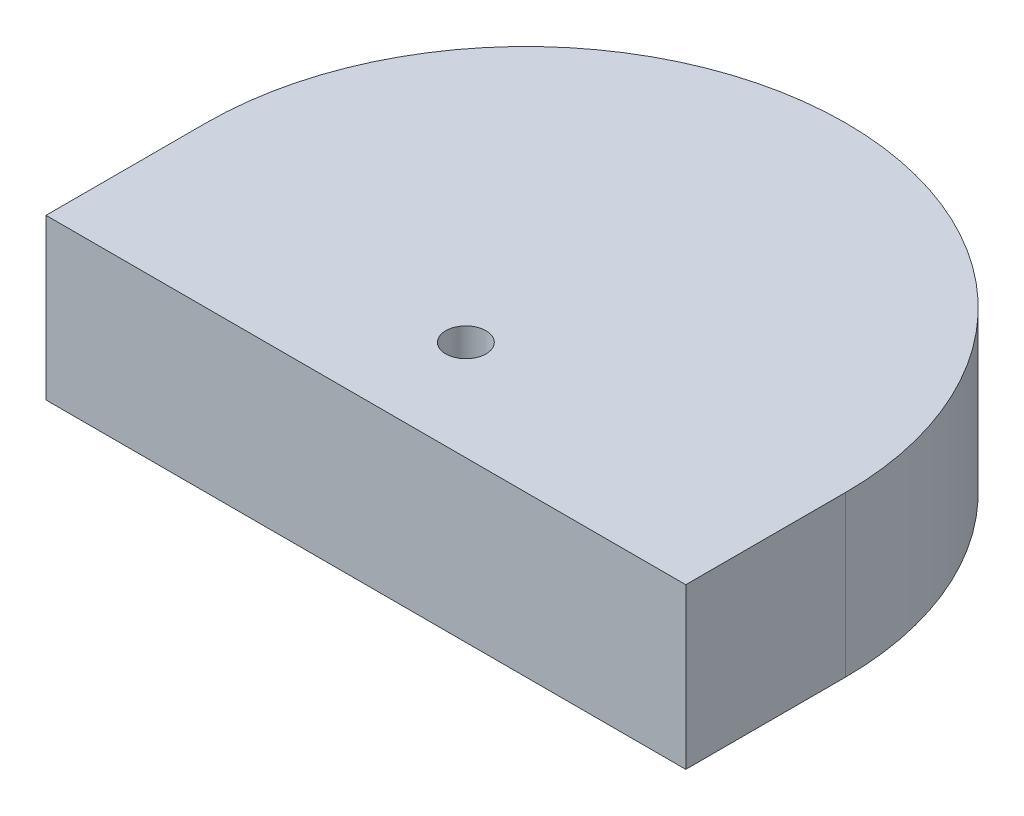
ISO-10303-21;
HEADER;
FILE_DESCRIPTION(('STEP AP214'),'2;1');
FILE_NAME('part.step','',(''),(''),'','','');
FILE_SCHEMA(('AUTOMOTIVE_DESIGN { 1 0 10303 214 1 1 1 1 }'));
ENDSEC;
DATA;
#1=APPLICATION_CONTEXT('core data for automotive mechanical design processes');
#2=APPLICATION_PROTOCOL_DEFINITION('international standard','automotive_design',2000,#1);
#3=PRODUCT_CONTEXT('',#1,'mechanical');
#4=PRODUCT('Part','Part','',(#3));
#5=PRODUCT_RELATED_PRODUCT_CATEGORY('part','',(#4));
#6=PRODUCT_DEFINITION_FORMATION('','',#4);
#7=PRODUCT_DEFINITION_CONTEXT('part definition',#1,'design');
#8=PRODUCT_DEFINITION('design','',#6,#7);
#9=PRODUCT_DEFINITION_SHAPE('','',#8);
#10=(LENGTH_UNIT() NAMED_UNIT(*) SI_UNIT(.MILLI.,.METRE.));
#11=(NAMED_UNIT(*) PLANE_ANGLE_UNIT() SI_UNIT($,.RADIAN.));
#12=(NAMED_UNIT(*) SI_UNIT($,.STERADIAN.) SOLID_ANGLE_UNIT());
#13=UNCERTAINTY_MEASURE_WITH_UNIT(LENGTH_MEASURE(1.E-05),#10,'distance_accuracy_value','');
#14=(GEOMETRIC_REPRESENTATION_CONTEXT(3) GLOBAL_UNCERTAINTY_ASSIGNED_CONTEXT((#13)) GLOBAL_UNIT_ASSIGNED_CONTEXT((#10,
#11,#12)) REPRESENTATION_CONTEXT('',''));
#15=CARTESIAN_POINT('',(0.,0.,0.));
#16=DIRECTION('',(0.,0.,1.));
#17=DIRECTION('',(1.,0.,0.));
#18=AXIS2_PLACEMENT_3D('',#15,#16,#17);
#19=CARTESIAN_POINT('',(0.,20.,0.));
#20=DIRECTION('',(0.,-1.,0.));
#21=DIRECTION('',(0.,0.,-1.));
#22=AXIS2_PLACEMENT_3D('',#19,#20,#21);
#23=CYLINDRICAL_SURFACE('',#22,40.);
#24=CARTESIAN_POINT('',(0.,0.,0.));
#25=DIRECTION('',(0.,1.,0.));
#26=DIRECTION('',(0.,0.,1.));
#27=AXIS2_PLACEMENT_3D('',#24,#25,#26);
#28=CIRCLE('',#27,40.);
#29=CARTESIAN_POINT('',(40.,0.,0.));
#30=VERTEX_POINT('',#29);
#31=CARTESIAN_POINT('',(-40.,0.,0.));
#32=VERTEX_POINT('',#31);
#33=EDGE_CURVE('E105',#30,#32,#28,.T.);
#34=ORIENTED_EDGE('',*,*,#33,.T.);
#35=DIRECTION('',(0.,-1.,0.));
#36=VECTOR('',#35,1.);
#37=CARTESIAN_POINT('',(-40.,20.,0.));
#38=LINE('',#37,#36);
#39=CARTESIAN_POINT('',(-40.,20.,0.));
#40=VERTEX_POINT('',#39);
#41=EDGE_CURVE('E11',#40,#32,#38,.T.);
#42=ORIENTED_EDGE('',*,*,#41,.F.);
#43=CARTESIAN_POINT('',(0.,20.,0.));
#44=DIRECTION('',(0.,1.,0.));
#45=DIRECTION('',(0.,0.,1.));
#46=AXIS2_PLACEMENT_3D('',#43,#44,#45);
#47=CIRCLE('',#46,40.);
#48=CARTESIAN_POINT('',(40.,20.,0.));
#49=VERTEX_POINT('',#48);
#50=EDGE_CURVE('E50',#49,#40,#47,.T.);
#51=ORIENTED_EDGE('',*,*,#50,.F.);
#52=DIRECTION('',(0.,-1.,0.));
#53=VECTOR('',#52,1.);
#54=CARTESIAN_POINT('',(40.,20.,0.));
#55=LINE('',#54,#53);
#56=EDGE_CURVE('E43',#49,#30,#55,.T.);
#57=ORIENTED_EDGE('',*,*,#56,.T.);
#58=EDGE_LOOP('',(#34,#42,#51,#57));
#59=FACE_BOUND('',#58,.T.);
#60=ADVANCED_FACE('F35',(#59),#23,.T.);
#61=CARTESIAN_POINT('',(0.,20.,0.));
#62=DIRECTION('',(0.,1.,0.));
#63=DIRECTION('',(0.,0.,1.));
#64=AXIS2_PLACEMENT_3D('',#61,#62,#63);
#65=PLANE('',#64);
#66=CARTESIAN_POINT('',(0.,20.,7.49999999999999));
#67=DIRECTION('',(0.,1.,0.));
#68=DIRECTION('',(0.,0.,1.));
#69=AXIS2_PLACEMENT_3D('',#66,#67,#68);
#70=CIRCLE('',#69,2.51821334694768);
#71=CARTESIAN_POINT('',(0.,20.,10.0182133469477));
#72=VERTEX_POINT('',#71);
#73=EDGE_CURVE('E98',#72,#72,#70,.T.);
#74=ORIENTED_EDGE('',*,*,#73,.F.);
#75=EDGE_LOOP('',(#74));
#76=FACE_BOUND('',#75,.T.);
#77=ORIENTED_EDGE('',*,*,#50,.T.);
#78=DIRECTION('',(0.,0.,1.));
#79=VECTOR('',#78,1.);
#80=CARTESIAN_POINT('',(-40.,20.,15.));
#81=LINE('',#80,#79);
#82=CARTESIAN_POINT('',(-40.,20.,20.));
#83=VERTEX_POINT('',#82);
#84=EDGE_CURVE('E80',#40,#83,#81,.T.);
#85=ORIENTED_EDGE('',*,*,#84,.T.);
#86=DIRECTION('',(-1.,0.,0.));
#87=VECTOR('',#86,1.);
#88=CARTESIAN_POINT('',(40.,20.,20.));
#89=LINE('',#88,#87);
#90=CARTESIAN_POINT('',(40.,20.,20.));
#91=VERTEX_POINT('',#90);
#92=EDGE_CURVE('E86',#91,#83,#89,.T.);
#93=ORIENTED_EDGE('',*,*,#92,.F.);
#94=DIRECTION('',(0.,0.,-1.));
#95=VECTOR('',#94,1.);
#96=CARTESIAN_POINT('',(40.,20.,15.));
#97=LINE('',#96,#95);
#98=EDGE_CURVE('E71',#91,#49,#97,.T.);
#99=ORIENTED_EDGE('',*,*,#98,.T.);
#100=EDGE_LOOP('',(#77,#85,#93,#99));
#101=FACE_BOUND('',#100,.T.);
#102=ADVANCED_FACE('F91',(#76,#101),#65,.T.);
#103=CARTESIAN_POINT('',(0.,0.,0.));
#104=DIRECTION('',(0.,1.,0.));
#105=DIRECTION('',(0.,0.,1.));
#106=AXIS2_PLACEMENT_3D('',#103,#104,#105);
#107=PLANE('',#106);
#108=CARTESIAN_POINT('',(0.,0.,7.49999999999999));
#109=DIRECTION('',(0.,1.,0.));
#110=DIRECTION('',(0.,0.,1.));
#111=AXIS2_PLACEMENT_3D('',#108,#109,#110);
#112=CIRCLE('',#111,2.51821334694768);
#113=CARTESIAN_POINT('',(0.,0.,10.0182133469477));
#114=VERTEX_POINT('',#113);
#115=EDGE_CURVE('E95',#114,#114,#112,.T.);
#116=ORIENTED_EDGE('',*,*,#115,.T.);
#117=EDGE_LOOP('',(#116));
#118=FACE_BOUND('',#117,.T.);
#119=ORIENTED_EDGE('',*,*,#33,.F.);
#120=DIRECTION('',(0.,0.,-1.));
#121=VECTOR('',#120,1.);
#122=CARTESIAN_POINT('',(40.,0.,15.));
#123=LINE('',#122,#121);
#124=CARTESIAN_POINT('',(40.,0.,20.));
#125=VERTEX_POINT('',#124);
#126=EDGE_CURVE('E103',#125,#30,#123,.T.);
#127=ORIENTED_EDGE('',*,*,#126,.F.);
#128=DIRECTION('',(-1.,0.,0.));
#129=VECTOR('',#128,1.);
#130=CARTESIAN_POINT('',(40.,0.,20.));
#131=LINE('',#130,#129);
#132=CARTESIAN_POINT('',(-40.,0.,20.));
#133=VERTEX_POINT('',#132);
#134=EDGE_CURVE('E88',#125,#133,#131,.T.);
#135=ORIENTED_EDGE('',*,*,#134,.T.);
#136=DIRECTION('',(0.,0.,1.));
#137=VECTOR('',#136,1.);
#138=CARTESIAN_POINT('',(-40.,0.,15.));
#139=LINE('',#138,#137);
#140=EDGE_CURVE('E79',#32,#133,#139,.T.);
#141=ORIENTED_EDGE('',*,*,#140,.F.);
#142=EDGE_LOOP('',(#119,#127,#135,#141));
#143=FACE_BOUND('',#142,.T.);
#144=ADVANCED_FACE('F110',(#118,#143),#107,.F.);
#145=CARTESIAN_POINT('',(-40.,0.,15.));
#146=DIRECTION('',(-1.,0.,0.));
#147=DIRECTION('',(0.,0.,1.));
#148=AXIS2_PLACEMENT_3D('',#145,#146,#147);
#149=PLANE('',#148);
#150=ORIENTED_EDGE('',*,*,#84,.F.);
#151=ORIENTED_EDGE('',*,*,#41,.T.);
#152=ORIENTED_EDGE('',*,*,#140,.T.);
#153=DIRECTION('',(0.,-1.,0.));
#154=VECTOR('',#153,1.);
#155=CARTESIAN_POINT('',(-40.,20.,20.));
#156=LINE('',#155,#154);
#157=EDGE_CURVE('E89',#83,#133,#156,.T.);
#158=ORIENTED_EDGE('',*,*,#157,.F.);
#159=EDGE_LOOP('',(#150,#151,#152,#158));
#160=FACE_BOUND('',#159,.T.);
#161=ADVANCED_FACE('F113',(#160),#149,.T.);
#162=CARTESIAN_POINT('',(40.,0.,15.));
#163=DIRECTION('',(1.,0.,0.));
#164=DIRECTION('',(0.,0.,-1.));
#165=AXIS2_PLACEMENT_3D('',#162,#163,#164);
#166=PLANE('',#165);
#167=ORIENTED_EDGE('',*,*,#98,.F.);
#168=DIRECTION('',(0.,-1.,0.));
#169=VECTOR('',#168,1.);
#170=CARTESIAN_POINT('',(40.,20.,20.));
#171=LINE('',#170,#169);
#172=EDGE_CURVE('E75',#91,#125,#171,.T.);
#173=ORIENTED_EDGE('',*,*,#172,.T.);
#174=ORIENTED_EDGE('',*,*,#126,.T.);
#175=ORIENTED_EDGE('',*,*,#56,.F.);
#176=EDGE_LOOP('',(#167,#173,#174,#175));
#177=FACE_BOUND('',#176,.T.);
#178=ADVANCED_FACE('F73',(#177),#166,.T.);
#179=CARTESIAN_POINT('',(40.,20.,20.));
#180=DIRECTION('',(0.,0.,1.));
#181=DIRECTION('',(1.,0.,0.));
#182=AXIS2_PLACEMENT_3D('',#179,#180,#181);
#183=PLANE('',#182);
#184=ORIENTED_EDGE('',*,*,#134,.F.);
#185=ORIENTED_EDGE('',*,*,#172,.F.);
#186=ORIENTED_EDGE('',*,*,#92,.T.);
#187=ORIENTED_EDGE('',*,*,#157,.T.);
#188=EDGE_LOOP('',(#184,#185,#186,#187));
#189=FACE_BOUND('',#188,.T.);
#190=ADVANCED_FACE('F84',(#189),#183,.T.);
#191=CARTESIAN_POINT('',(0.,0.,7.49999999999999));
#192=DIRECTION('',(0.,1.,0.));
#193=DIRECTION('',(0.,0.,1.));
#194=AXIS2_PLACEMENT_3D('',#191,#192,#193);
#195=CYLINDRICAL_SURFACE('',#194,2.51821334694768);
#196=ORIENTED_EDGE('',*,*,#115,.F.);
#197=EDGE_LOOP('',(#196));
#198=FACE_BOUND('',#197,.T.);
#199=ORIENTED_EDGE('',*,*,#73,.T.);
#200=EDGE_LOOP('',(#199));
#201=FACE_BOUND('',#200,.T.);
#202=ADVANCED_FACE('F136',(#198,#201),#195,.F.);
#203=CLOSED_SHELL('',(#60,#102,#144,#161,#178,#190,#202));
#204=MANIFOLD_SOLID_BREP('B2',#203);
#205=ADVANCED_BREP_SHAPE_REPRESENTATION('',(#18,#204),#14);
#206=SHAPE_DEFINITION_REPRESENTATION(#9,#205);
ENDSEC;
END-ISO-10303-21;
